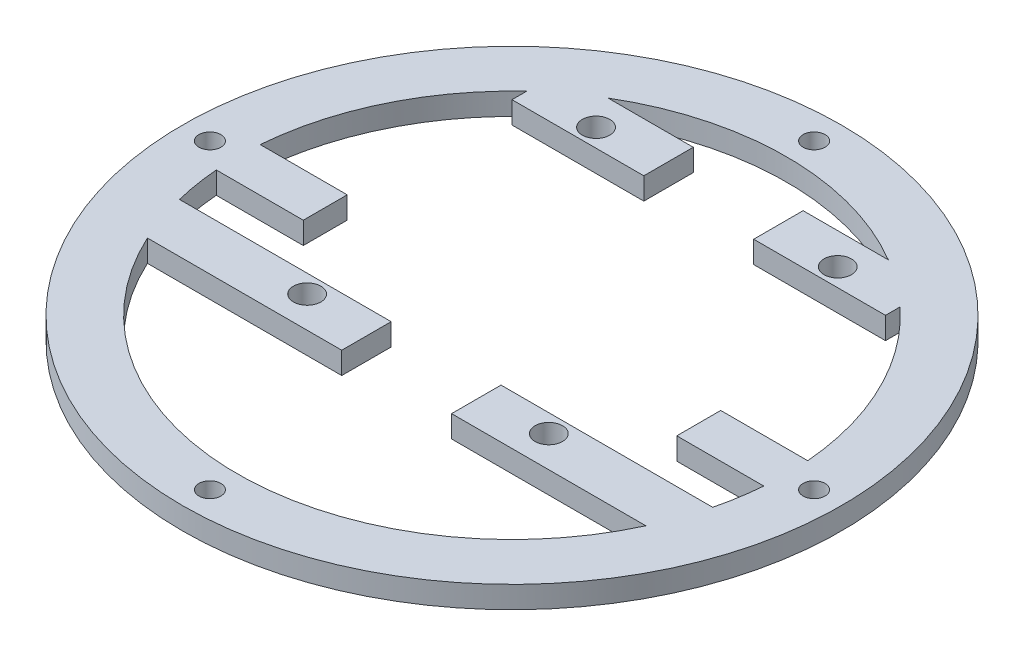
ISO-10303-21;
HEADER;
FILE_DESCRIPTION(('STEP AP214'),'2;1');
FILE_NAME('part.step','',(''),(''),'','','');
FILE_SCHEMA(('AUTOMOTIVE_DESIGN { 1 0 10303 214 1 1 1 1 }'));
ENDSEC;
DATA;
#1=APPLICATION_CONTEXT('core data for automotive mechanical design processes');
#2=APPLICATION_PROTOCOL_DEFINITION('international standard','automotive_design',2000,#1);
#3=PRODUCT_CONTEXT('',#1,'mechanical');
#4=PRODUCT('Part','Part','',(#3));
#5=PRODUCT_RELATED_PRODUCT_CATEGORY('part','',(#4));
#6=PRODUCT_DEFINITION_FORMATION('','',#4);
#7=PRODUCT_DEFINITION_CONTEXT('part definition',#1,'design');
#8=PRODUCT_DEFINITION('design','',#6,#7);
#9=PRODUCT_DEFINITION_SHAPE('','',#8);
#10=(LENGTH_UNIT() NAMED_UNIT(*) SI_UNIT(.MILLI.,.METRE.));
#11=(NAMED_UNIT(*) PLANE_ANGLE_UNIT() SI_UNIT($,.RADIAN.));
#12=(NAMED_UNIT(*) SI_UNIT($,.STERADIAN.) SOLID_ANGLE_UNIT());
#13=UNCERTAINTY_MEASURE_WITH_UNIT(LENGTH_MEASURE(1.E-05),#10,'distance_accuracy_value','');
#14=(GEOMETRIC_REPRESENTATION_CONTEXT(3) GLOBAL_UNCERTAINTY_ASSIGNED_CONTEXT((#13)) GLOBAL_UNIT_ASSIGNED_CONTEXT((#10,
#11,#12)) REPRESENTATION_CONTEXT('',''));
#15=CARTESIAN_POINT('',(0.,0.,0.));
#16=DIRECTION('',(0.,0.,1.));
#17=DIRECTION('',(1.,0.,0.));
#18=AXIS2_PLACEMENT_3D('',#15,#16,#17);
#19=CARTESIAN_POINT('',(0.,2.,0.));
#20=DIRECTION('',(0.,-1.,0.));
#21=DIRECTION('',(0.,0.,-1.));
#22=AXIS2_PLACEMENT_3D('',#19,#20,#21);
#23=CYLINDRICAL_SURFACE('',#22,25.);
#24=CARTESIAN_POINT('',(0.,2.,0.));
#25=DIRECTION('',(0.,1.,0.));
#26=DIRECTION('',(0.,0.,1.));
#27=AXIS2_PLACEMENT_3D('',#24,#25,#26);
#28=CIRCLE('',#27,25.);
#29=CARTESIAN_POINT('',(-24.9198715887542,2.,2.));
#30=VERTEX_POINT('',#29);
#31=CARTESIAN_POINT('',(-24.2693221990232,2.,6.));
#32=VERTEX_POINT('',#31);
#33=EDGE_CURVE('E321',#30,#32,#28,.T.);
#34=ORIENTED_EDGE('',*,*,#33,.T.);
#35=DIRECTION('',(0.,-1.,0.));
#36=VECTOR('',#35,1.);
#37=CARTESIAN_POINT('',(-24.2693221990232,2.,6.));
#38=LINE('',#37,#36);
#39=CARTESIAN_POINT('',(-24.2693221990232,0.,6.));
#40=VERTEX_POINT('',#39);
#41=EDGE_CURVE('E221',#32,#40,#38,.T.);
#42=ORIENTED_EDGE('',*,*,#41,.T.);
#43=CARTESIAN_POINT('',(0.,0.,0.));
#44=DIRECTION('',(0.,1.,0.));
#45=DIRECTION('',(0.,0.,1.));
#46=AXIS2_PLACEMENT_3D('',#43,#44,#45);
#47=CIRCLE('',#46,25.);
#48=CARTESIAN_POINT('',(-24.9198715887542,0.,2.));
#49=VERTEX_POINT('',#48);
#50=EDGE_CURVE('E314',#49,#40,#47,.T.);
#51=ORIENTED_EDGE('',*,*,#50,.F.);
#52=DIRECTION('',(0.,-1.,0.));
#53=VECTOR('',#52,1.);
#54=CARTESIAN_POINT('',(-24.9198715887542,2.,2.));
#55=LINE('',#54,#53);
#56=EDGE_CURVE('E375',#30,#49,#55,.T.);
#57=ORIENTED_EDGE('',*,*,#56,.F.);
#58=EDGE_LOOP('',(#34,#42,#51,#57));
#59=FACE_BOUND('',#58,.T.);
#60=ADVANCED_FACE('F41',(#59),#23,.F.);
#61=CARTESIAN_POINT('',(-22.6881026090769,0.,10.5));
#62=VERTEX_POINT('',#61);
#63=CARTESIAN_POINT('',(22.6881026090769,0.,10.5));
#64=VERTEX_POINT('',#63);
#65=EDGE_CURVE('E319',#62,#64,#47,.T.);
#66=ORIENTED_EDGE('',*,*,#65,.F.);
#67=DIRECTION('',(0.,-1.,0.));
#68=VECTOR('',#67,1.);
#69=CARTESIAN_POINT('',(-22.6881026090769,2.,10.5));
#70=LINE('',#69,#68);
#71=CARTESIAN_POINT('',(-22.6881026090769,2.,10.5));
#72=VERTEX_POINT('',#71);
#73=EDGE_CURVE('E252',#72,#62,#70,.T.);
#74=ORIENTED_EDGE('',*,*,#73,.F.);
#75=CARTESIAN_POINT('',(22.6881026090769,2.,10.5));
#76=VERTEX_POINT('',#75);
#77=EDGE_CURVE('E325',#72,#76,#28,.T.);
#78=ORIENTED_EDGE('',*,*,#77,.T.);
#79=DIRECTION('',(0.,-1.,0.));
#80=VECTOR('',#79,1.);
#81=CARTESIAN_POINT('',(22.6881026090769,2.,10.5));
#82=LINE('',#81,#80);
#83=EDGE_CURVE('E292',#76,#64,#82,.T.);
#84=ORIENTED_EDGE('',*,*,#83,.T.);
#85=EDGE_LOOP('',(#66,#74,#78,#84));
#86=FACE_BOUND('',#85,.T.);
#87=ADVANCED_FACE('F537',(#86),#23,.F.);
#88=CARTESIAN_POINT('',(24.2693221990232,0.,6.));
#89=VERTEX_POINT('',#88);
#90=CARTESIAN_POINT('',(24.9198715887542,0.,2.));
#91=VERTEX_POINT('',#90);
#92=EDGE_CURVE('E469',#89,#91,#47,.T.);
#93=ORIENTED_EDGE('',*,*,#92,.F.);
#94=DIRECTION('',(0.,-1.,0.));
#95=VECTOR('',#94,1.);
#96=CARTESIAN_POINT('',(24.2693221990232,2.,6.));
#97=LINE('',#96,#95);
#98=CARTESIAN_POINT('',(24.2693221990232,2.,6.));
#99=VERTEX_POINT('',#98);
#100=EDGE_CURVE('E284',#99,#89,#97,.T.);
#101=ORIENTED_EDGE('',*,*,#100,.F.);
#102=CARTESIAN_POINT('',(24.9198715887542,2.,2.));
#103=VERTEX_POINT('',#102);
#104=EDGE_CURVE('E384',#99,#103,#28,.T.);
#105=ORIENTED_EDGE('',*,*,#104,.T.);
#106=DIRECTION('',(0.,-1.,0.));
#107=VECTOR('',#106,1.);
#108=CARTESIAN_POINT('',(24.9198715887542,2.,2.));
#109=LINE('',#108,#107);
#110=EDGE_CURVE('E324',#103,#91,#109,.T.);
#111=ORIENTED_EDGE('',*,*,#110,.T.);
#112=EDGE_LOOP('',(#93,#101,#105,#111));
#113=FACE_BOUND('',#112,.T.);
#114=ADVANCED_FACE('F548',(#113),#23,.F.);
#115=CARTESIAN_POINT('',(17.,2.,0.));
#116=DIRECTION('',(-1.,0.,0.));
#117=DIRECTION('',(0.,0.,1.));
#118=AXIS2_PLACEMENT_3D('',#115,#116,#117);
#119=PLANE('',#118);
#120=DIRECTION('',(0.,1.,0.));
#121=VECTOR('',#120,1.);
#122=CARTESIAN_POINT('',(17.,0.,-17.));
#123=LINE('',#122,#121);
#124=CARTESIAN_POINT('',(17.,0.,-17.));
#125=VERTEX_POINT('',#124);
#126=CARTESIAN_POINT('',(17.,2.,-17.));
#127=VERTEX_POINT('',#126);
#128=EDGE_CURVE('E442',#125,#127,#123,.T.);
#129=ORIENTED_EDGE('',*,*,#128,.F.);
#130=DIRECTION('',(0.,0.,-1.));
#131=VECTOR('',#130,1.);
#132=CARTESIAN_POINT('',(17.,0.,0.));
#133=LINE('',#132,#131);
#134=CARTESIAN_POINT('',(17.,0.,-18.3303027798234));
#135=VERTEX_POINT('',#134);
#136=EDGE_CURVE('E296',#125,#135,#133,.T.);
#137=ORIENTED_EDGE('',*,*,#136,.T.);
#138=DIRECTION('',(0.,-1.,0.));
#139=VECTOR('',#138,1.);
#140=CARTESIAN_POINT('',(17.,2.,-18.3303027798234));
#141=LINE('',#140,#139);
#142=CARTESIAN_POINT('',(17.,2.,-18.3303027798234));
#143=VERTEX_POINT('',#142);
#144=EDGE_CURVE('E401',#143,#135,#141,.T.);
#145=ORIENTED_EDGE('',*,*,#144,.F.);
#146=DIRECTION('',(0.,0.,-1.));
#147=VECTOR('',#146,1.);
#148=CARTESIAN_POINT('',(17.,2.,10.5));
#149=LINE('',#148,#147);
#150=EDGE_CURVE('E394',#127,#143,#149,.T.);
#151=ORIENTED_EDGE('',*,*,#150,.F.);
#152=EDGE_LOOP('',(#129,#137,#145,#151));
#153=FACE_BOUND('',#152,.T.);
#154=ADVANCED_FACE('F586',(#153),#119,.F.);
#155=CARTESIAN_POINT('',(5.,2.,-21.5));
#156=DIRECTION('',(1.,0.,0.));
#157=DIRECTION('',(0.,0.,-1.));
#158=AXIS2_PLACEMENT_3D('',#155,#156,#157);
#159=PLANE('',#158);
#160=DIRECTION('',(0.,1.,0.));
#161=VECTOR('',#160,1.);
#162=CARTESIAN_POINT('',(5.,0.,-17.));
#163=LINE('',#162,#161);
#164=CARTESIAN_POINT('',(5.,0.,-17.));
#165=VERTEX_POINT('',#164);
#166=CARTESIAN_POINT('',(5.,2.,-17.));
#167=VERTEX_POINT('',#166);
#168=EDGE_CURVE('E414',#165,#167,#163,.T.);
#169=ORIENTED_EDGE('',*,*,#168,.T.);
#170=DIRECTION('',(0.,0.,1.));
#171=VECTOR('',#170,1.);
#172=CARTESIAN_POINT('',(5.,2.,-21.5));
#173=LINE('',#172,#171);
#174=CARTESIAN_POINT('',(5.,2.,-21.5));
#175=VERTEX_POINT('',#174);
#176=EDGE_CURVE('E419',#175,#167,#173,.T.);
#177=ORIENTED_EDGE('',*,*,#176,.F.);
#178=DIRECTION('',(0.,-1.,0.));
#179=VECTOR('',#178,1.);
#180=CARTESIAN_POINT('',(5.,2.,-21.5));
#181=LINE('',#180,#179);
#182=CARTESIAN_POINT('',(5.,0.,-21.5));
#183=VERTEX_POINT('',#182);
#184=EDGE_CURVE('E409',#175,#183,#181,.T.);
#185=ORIENTED_EDGE('',*,*,#184,.T.);
#186=DIRECTION('',(0.,0.,1.));
#187=VECTOR('',#186,1.);
#188=CARTESIAN_POINT('',(5.,0.,-21.5));
#189=LINE('',#188,#187);
#190=EDGE_CURVE('E413',#183,#165,#189,.T.);
#191=ORIENTED_EDGE('',*,*,#190,.T.);
#192=EDGE_LOOP('',(#169,#177,#185,#191));
#193=FACE_BOUND('',#192,.T.);
#194=ADVANCED_FACE('F593',(#193),#159,.F.);
#195=CARTESIAN_POINT('',(-17.,0.,-18.3303027798234));
#196=VERTEX_POINT('',#195);
#197=CARTESIAN_POINT('',(-24.9198715887542,0.,-2.));
#198=VERTEX_POINT('',#197);
#199=EDGE_CURVE('E358',#196,#198,#47,.T.);
#200=ORIENTED_EDGE('',*,*,#199,.F.);
#201=DIRECTION('',(0.,-1.,0.));
#202=VECTOR('',#201,1.);
#203=CARTESIAN_POINT('',(-17.,2.,-18.3303027798234));
#204=LINE('',#203,#202);
#205=CARTESIAN_POINT('',(-17.,2.,-18.3303027798234));
#206=VERTEX_POINT('',#205);
#207=EDGE_CURVE('E424',#206,#196,#204,.T.);
#208=ORIENTED_EDGE('',*,*,#207,.F.);
#209=CARTESIAN_POINT('',(-24.9198715887542,2.,-2.));
#210=VERTEX_POINT('',#209);
#211=EDGE_CURVE('E374',#206,#210,#28,.T.);
#212=ORIENTED_EDGE('',*,*,#211,.T.);
#213=DIRECTION('',(0.,-1.,0.));
#214=VECTOR('',#213,1.);
#215=CARTESIAN_POINT('',(-24.9198715887542,2.,-2.));
#216=LINE('',#215,#214);
#217=EDGE_CURVE('E369',#210,#198,#216,.T.);
#218=ORIENTED_EDGE('',*,*,#217,.T.);
#219=EDGE_LOOP('',(#200,#208,#212,#218));
#220=FACE_BOUND('',#219,.T.);
#221=ADVANCED_FACE('F601',(#220),#23,.F.);
#222=CARTESIAN_POINT('',(12.7573508221731,2.,-21.5));
#223=VERTEX_POINT('',#222);
#224=CARTESIAN_POINT('',(-12.7573508221731,2.,-21.5));
#225=VERTEX_POINT('',#224);
#226=EDGE_CURVE('E373',#223,#225,#28,.T.);
#227=ORIENTED_EDGE('',*,*,#226,.T.);
#228=DIRECTION('',(0.,-1.,0.));
#229=VECTOR('',#228,1.);
#230=CARTESIAN_POINT('',(-12.7573508221731,2.,-21.5));
#231=LINE('',#230,#229);
#232=CARTESIAN_POINT('',(-12.7573508221731,0.,-21.5));
#233=VERTEX_POINT('',#232);
#234=EDGE_CURVE('E380',#225,#233,#231,.T.);
#235=ORIENTED_EDGE('',*,*,#234,.T.);
#236=CARTESIAN_POINT('',(12.7573508221731,0.,-21.5));
#237=VERTEX_POINT('',#236);
#238=EDGE_CURVE('E474',#237,#233,#47,.T.);
#239=ORIENTED_EDGE('',*,*,#238,.F.);
#240=DIRECTION('',(0.,-1.,0.));
#241=VECTOR('',#240,1.);
#242=CARTESIAN_POINT('',(12.7573508221731,2.,-21.5));
#243=LINE('',#242,#241);
#244=EDGE_CURVE('E405',#223,#237,#243,.T.);
#245=ORIENTED_EDGE('',*,*,#244,.F.);
#246=EDGE_LOOP('',(#227,#235,#239,#245));
#247=FACE_BOUND('',#246,.T.);
#248=ADVANCED_FACE('F596',(#247),#23,.F.);
#249=CARTESIAN_POINT('',(0.,2.,2.));
#250=DIRECTION('',(0.,0.,-1.));
#251=DIRECTION('',(-1.,0.,0.));
#252=AXIS2_PLACEMENT_3D('',#249,#250,#251);
#253=PLANE('',#252);
#254=DIRECTION('',(0.,-1.,0.));
#255=VECTOR('',#254,1.);
#256=CARTESIAN_POINT('',(-17.,2.,2.));
#257=LINE('',#256,#255);
#258=CARTESIAN_POINT('',(-17.,2.,2.));
#259=VERTEX_POINT('',#258);
#260=CARTESIAN_POINT('',(-17.,0.,2.));
#261=VERTEX_POINT('',#260);
#262=EDGE_CURVE('E11',#259,#261,#257,.T.);
#263=ORIENTED_EDGE('',*,*,#262,.F.);
#264=DIRECTION('',(1.,0.,0.));
#265=VECTOR('',#264,1.);
#266=CARTESIAN_POINT('',(0.,2.,2.));
#267=LINE('',#266,#265);
#268=EDGE_CURVE('E313',#30,#259,#267,.T.);
#269=ORIENTED_EDGE('',*,*,#268,.F.);
#270=ORIENTED_EDGE('',*,*,#56,.T.);
#271=DIRECTION('',(1.,0.,0.));
#272=VECTOR('',#271,1.);
#273=CARTESIAN_POINT('',(0.,0.,2.));
#274=LINE('',#273,#272);
#275=EDGE_CURVE('E379',#49,#261,#274,.T.);
#276=ORIENTED_EDGE('',*,*,#275,.T.);
#277=EDGE_LOOP('',(#263,#269,#270,#276));
#278=FACE_BOUND('',#277,.T.);
#279=ADVANCED_FACE('F610',(#278),#253,.F.);
#280=CARTESIAN_POINT('',(0.,2.,-2.));
#281=DIRECTION('',(0.,0.,1.));
#282=DIRECTION('',(1.,0.,0.));
#283=AXIS2_PLACEMENT_3D('',#280,#281,#282);
#284=PLANE('',#283);
#285=DIRECTION('',(0.,1.,0.));
#286=VECTOR('',#285,1.);
#287=CARTESIAN_POINT('',(-17.,2.,-2.));
#288=LINE('',#287,#286);
#289=CARTESIAN_POINT('',(-17.,0.,-2.));
#290=VERTEX_POINT('',#289);
#291=CARTESIAN_POINT('',(-17.,2.,-2.));
#292=VERTEX_POINT('',#291);
#293=EDGE_CURVE('E400',#290,#292,#288,.T.);
#294=ORIENTED_EDGE('',*,*,#293,.F.);
#295=DIRECTION('',(-1.,0.,0.));
#296=VECTOR('',#295,1.);
#297=CARTESIAN_POINT('',(0.,0.,-2.));
#298=LINE('',#297,#296);
#299=EDGE_CURVE('E385',#290,#198,#298,.T.);
#300=ORIENTED_EDGE('',*,*,#299,.T.);
#301=ORIENTED_EDGE('',*,*,#217,.F.);
#302=DIRECTION('',(-1.,0.,0.));
#303=VECTOR('',#302,1.);
#304=CARTESIAN_POINT('',(0.,2.,-2.));
#305=LINE('',#304,#303);
#306=EDGE_CURVE('E362',#292,#210,#305,.T.);
#307=ORIENTED_EDGE('',*,*,#306,.F.);
#308=EDGE_LOOP('',(#294,#300,#301,#307));
#309=FACE_BOUND('',#308,.T.);
#310=ADVANCED_FACE('F606',(#309),#284,.F.);
#311=CARTESIAN_POINT('',(24.9198715887542,2.,-2.));
#312=VERTEX_POINT('',#311);
#313=EDGE_CURVE('E326',#312,#143,#28,.T.);
#314=ORIENTED_EDGE('',*,*,#313,.T.);
#315=ORIENTED_EDGE('',*,*,#144,.T.);
#316=CARTESIAN_POINT('',(24.9198715887542,0.,-2.));
#317=VERTEX_POINT('',#316);
#318=EDGE_CURVE('E320',#317,#135,#47,.T.);
#319=ORIENTED_EDGE('',*,*,#318,.F.);
#320=DIRECTION('',(0.,-1.,0.));
#321=VECTOR('',#320,1.);
#322=CARTESIAN_POINT('',(24.9198715887542,2.,-2.));
#323=LINE('',#322,#321);
#324=EDGE_CURVE('E363',#312,#317,#323,.T.);
#325=ORIENTED_EDGE('',*,*,#324,.F.);
#326=EDGE_LOOP('',(#314,#315,#319,#325));
#327=FACE_BOUND('',#326,.T.);
#328=ADVANCED_FACE('F581',(#327),#23,.F.);
#329=DIRECTION('',(0.,1.,0.));
#330=VECTOR('',#329,1.);
#331=CARTESIAN_POINT('',(17.,2.,2.));
#332=LINE('',#331,#330);
#333=CARTESIAN_POINT('',(17.,0.,2.));
#334=VERTEX_POINT('',#333);
#335=CARTESIAN_POINT('',(17.,2.,2.));
#336=VERTEX_POINT('',#335);
#337=EDGE_CURVE('E300',#334,#336,#332,.T.);
#338=ORIENTED_EDGE('',*,*,#337,.F.);
#339=EDGE_CURVE('E368',#334,#91,#274,.T.);
#340=ORIENTED_EDGE('',*,*,#339,.T.);
#341=ORIENTED_EDGE('',*,*,#110,.F.);
#342=EDGE_CURVE('E393',#336,#103,#267,.T.);
#343=ORIENTED_EDGE('',*,*,#342,.F.);
#344=EDGE_LOOP('',(#338,#340,#341,#343));
#345=FACE_BOUND('',#344,.T.);
#346=ADVANCED_FACE('F554',(#345),#253,.F.);
#347=DIRECTION('',(0.,-1.,0.));
#348=VECTOR('',#347,1.);
#349=CARTESIAN_POINT('',(17.,2.,-2.));
#350=LINE('',#349,#348);
#351=CARTESIAN_POINT('',(17.,2.,-2.));
#352=VERTEX_POINT('',#351);
#353=CARTESIAN_POINT('',(17.,0.,-2.));
#354=VERTEX_POINT('',#353);
#355=EDGE_CURVE('E297',#352,#354,#350,.T.);
#356=ORIENTED_EDGE('',*,*,#355,.F.);
#357=EDGE_CURVE('E389',#312,#352,#305,.T.);
#358=ORIENTED_EDGE('',*,*,#357,.F.);
#359=ORIENTED_EDGE('',*,*,#324,.T.);
#360=EDGE_CURVE('E367',#317,#354,#298,.T.);
#361=ORIENTED_EDGE('',*,*,#360,.T.);
#362=EDGE_LOOP('',(#356,#358,#359,#361));
#363=FACE_BOUND('',#362,.T.);
#364=ADVANCED_FACE('F575',(#363),#284,.F.);
#365=CARTESIAN_POINT('',(0.,2.,0.));
#366=DIRECTION('',(0.,1.,0.));
#367=DIRECTION('',(0.,0.,1.));
#368=AXIS2_PLACEMENT_3D('',#365,#366,#367);
#369=PLANE('',#368);
#370=CARTESIAN_POINT('',(-11.,2.,-18.65));
#371=DIRECTION('',(0.,1.,0.));
#372=DIRECTION('',(0.,0.,1.));
#373=AXIS2_PLACEMENT_3D('',#370,#371,#372);
#374=CIRCLE('',#373,1.25);
#375=CARTESIAN_POINT('',(-11.,2.,-17.4));
#376=VERTEX_POINT('',#375);
#377=EDGE_CURVE('E704',#376,#376,#374,.T.);
#378=ORIENTED_EDGE('',*,*,#377,.F.);
#379=EDGE_LOOP('',(#378));
#380=FACE_BOUND('',#379,.T.);
#381=CARTESIAN_POINT('',(-11.,2.,7.65));
#382=DIRECTION('',(0.,1.,0.));
#383=DIRECTION('',(0.,0.,1.));
#384=AXIS2_PLACEMENT_3D('',#381,#382,#383);
#385=CIRCLE('',#384,1.25);
#386=CARTESIAN_POINT('',(-11.,2.,8.9));
#387=VERTEX_POINT('',#386);
#388=EDGE_CURVE('E710',#387,#387,#385,.T.);
#389=ORIENTED_EDGE('',*,*,#388,.F.);
#390=EDGE_LOOP('',(#389));
#391=FACE_BOUND('',#390,.T.);
#392=CARTESIAN_POINT('',(11.,2.,7.65));
#393=DIRECTION('',(0.,1.,0.));
#394=DIRECTION('',(0.,0.,1.));
#395=AXIS2_PLACEMENT_3D('',#392,#393,#394);
#396=CIRCLE('',#395,1.25);
#397=CARTESIAN_POINT('',(11.,2.,8.9));
#398=VERTEX_POINT('',#397);
#399=EDGE_CURVE('E699',#398,#398,#396,.T.);
#400=ORIENTED_EDGE('',*,*,#399,.F.);
#401=EDGE_LOOP('',(#400));
#402=FACE_BOUND('',#401,.T.);
#403=CARTESIAN_POINT('',(11.,2.,-18.65));
#404=DIRECTION('',(0.,1.,0.));
#405=DIRECTION('',(0.,0.,1.));
#406=AXIS2_PLACEMENT_3D('',#403,#404,#405);
#407=CIRCLE('',#406,1.25);
#408=CARTESIAN_POINT('',(11.,2.,-17.4));
#409=VERTEX_POINT('',#408);
#410=EDGE_CURVE('E695',#409,#409,#407,.T.);
#411=ORIENTED_EDGE('',*,*,#410,.F.);
#412=EDGE_LOOP('',(#411));
#413=FACE_BOUND('',#412,.T.);
#414=DIRECTION('',(0.,0.,1.));
#415=VECTOR('',#414,1.);
#416=CARTESIAN_POINT('',(-17.,2.,0.));
#417=LINE('',#416,#415);
#418=EDGE_CURVE('E51',#292,#259,#417,.T.);
#419=ORIENTED_EDGE('',*,*,#418,.F.);
#420=ORIENTED_EDGE('',*,*,#306,.T.);
#421=ORIENTED_EDGE('',*,*,#211,.F.);
#422=DIRECTION('',(0.,0.,1.));
#423=VECTOR('',#422,1.);
#424=CARTESIAN_POINT('',(-17.,2.,-18.3303027798234));
#425=LINE('',#424,#423);
#426=CARTESIAN_POINT('',(-17.,2.,-17.));
#427=VERTEX_POINT('',#426);
#428=EDGE_CURVE('E492',#206,#427,#425,.T.);
#429=ORIENTED_EDGE('',*,*,#428,.T.);
#430=DIRECTION('',(-1.,0.,0.));
#431=VECTOR('',#430,1.);
#432=CARTESIAN_POINT('',(0.,2.,-17.));
#433=LINE('',#432,#431);
#434=CARTESIAN_POINT('',(-5.,2.,-17.));
#435=VERTEX_POINT('',#434);
#436=EDGE_CURVE('E433',#435,#427,#433,.T.);
#437=ORIENTED_EDGE('',*,*,#436,.F.);
#438=DIRECTION('',(0.,0.,-1.));
#439=VECTOR('',#438,1.);
#440=CARTESIAN_POINT('',(-5.,2.,10.5));
#441=LINE('',#440,#439);
#442=CARTESIAN_POINT('',(-5.,2.,-21.5));
#443=VERTEX_POINT('',#442);
#444=EDGE_CURVE('E441',#435,#443,#441,.T.);
#445=ORIENTED_EDGE('',*,*,#444,.T.);
#446=DIRECTION('',(-1.,0.,0.));
#447=VECTOR('',#446,1.);
#448=CARTESIAN_POINT('',(-5.,2.,-21.5));
#449=LINE('',#448,#447);
#450=EDGE_CURVE('E420',#443,#225,#449,.T.);
#451=ORIENTED_EDGE('',*,*,#450,.T.);
#452=ORIENTED_EDGE('',*,*,#226,.F.);
#453=DIRECTION('',(-1.,0.,0.));
#454=VECTOR('',#453,1.);
#455=CARTESIAN_POINT('',(12.7573508221731,2.,-21.5));
#456=LINE('',#455,#454);
#457=EDGE_CURVE('E417',#223,#175,#456,.T.);
#458=ORIENTED_EDGE('',*,*,#457,.T.);
#459=ORIENTED_EDGE('',*,*,#176,.T.);
#460=DIRECTION('',(1.,0.,0.));
#461=VECTOR('',#460,1.);
#462=CARTESIAN_POINT('',(0.,2.,-17.));
#463=LINE('',#462,#461);
#464=EDGE_CURVE('E460',#167,#127,#463,.T.);
#465=ORIENTED_EDGE('',*,*,#464,.T.);
#466=ORIENTED_EDGE('',*,*,#150,.T.);
#467=ORIENTED_EDGE('',*,*,#313,.F.);
#468=ORIENTED_EDGE('',*,*,#357,.T.);
#469=DIRECTION('',(0.,0.,-1.));
#470=VECTOR('',#469,1.);
#471=CARTESIAN_POINT('',(17.,2.,0.));
#472=LINE('',#471,#470);
#473=EDGE_CURVE('E301',#336,#352,#472,.T.);
#474=ORIENTED_EDGE('',*,*,#473,.F.);
#475=ORIENTED_EDGE('',*,*,#342,.T.);
#476=ORIENTED_EDGE('',*,*,#104,.F.);
#477=DIRECTION('',(-1.,0.,0.));
#478=VECTOR('',#477,1.);
#479=CARTESIAN_POINT('',(17.,2.,6.));
#480=LINE('',#479,#478);
#481=CARTESIAN_POINT('',(5.,2.,6.));
#482=VERTEX_POINT('',#481);
#483=EDGE_CURVE('E281',#99,#482,#480,.T.);
#484=ORIENTED_EDGE('',*,*,#483,.T.);
#485=DIRECTION('',(0.,0.,1.));
#486=VECTOR('',#485,1.);
#487=CARTESIAN_POINT('',(5.,2.,-21.5));
#488=LINE('',#487,#486);
#489=CARTESIAN_POINT('',(5.,2.,10.5));
#490=VERTEX_POINT('',#489);
#491=EDGE_CURVE('E265',#482,#490,#488,.T.);
#492=ORIENTED_EDGE('',*,*,#491,.T.);
#493=DIRECTION('',(1.,0.,0.));
#494=VECTOR('',#493,1.);
#495=CARTESIAN_POINT('',(17.,2.,10.5));
#496=LINE('',#495,#494);
#497=EDGE_CURVE('E277',#490,#76,#496,.T.);
#498=ORIENTED_EDGE('',*,*,#497,.T.);
#499=ORIENTED_EDGE('',*,*,#77,.F.);
#500=DIRECTION('',(1.,0.,0.));
#501=VECTOR('',#500,1.);
#502=CARTESIAN_POINT('',(-17.,2.,10.5));
#503=LINE('',#502,#501);
#504=CARTESIAN_POINT('',(-5.,2.,10.5));
#505=VERTEX_POINT('',#504);
#506=EDGE_CURVE('E227',#72,#505,#503,.T.);
#507=ORIENTED_EDGE('',*,*,#506,.T.);
#508=DIRECTION('',(0.,0.,-1.));
#509=VECTOR('',#508,1.);
#510=CARTESIAN_POINT('',(-5.,2.,10.5));
#511=LINE('',#510,#509);
#512=CARTESIAN_POINT('',(-5.,2.,6.));
#513=VERTEX_POINT('',#512);
#514=EDGE_CURVE('E233',#505,#513,#511,.T.);
#515=ORIENTED_EDGE('',*,*,#514,.T.);
#516=DIRECTION('',(-1.,0.,0.));
#517=VECTOR('',#516,1.);
#518=CARTESIAN_POINT('',(-17.,2.,6.));
#519=LINE('',#518,#517);
#520=EDGE_CURVE('E215',#513,#32,#519,.T.);
#521=ORIENTED_EDGE('',*,*,#520,.T.);
#522=ORIENTED_EDGE('',*,*,#33,.F.);
#523=ORIENTED_EDGE('',*,*,#268,.T.);
#524=EDGE_LOOP('',(#419,#420,#421,#429,#437,#445,#451,#452,#458,#459,#465,#466,#467,#468,#474,
#475,#476,#484,#492,#498,#499,#507,#515,#521,#522,#523));
#525=FACE_BOUND('',#524,.T.);
#526=CARTESIAN_POINT('',(-27.5,2.,0.));
#527=DIRECTION('',(0.,1.,0.));
#528=DIRECTION('',(0.,0.,1.));
#529=AXIS2_PLACEMENT_3D('',#526,#527,#528);
#530=CIRCLE('',#529,1.);
#531=CARTESIAN_POINT('',(-27.5,2.,1.));
#532=VERTEX_POINT('',#531);
#533=EDGE_CURVE('E350',#532,#532,#530,.T.);
#534=ORIENTED_EDGE('',*,*,#533,.F.);
#535=EDGE_LOOP('',(#534));
#536=FACE_BOUND('',#535,.T.);
#537=CARTESIAN_POINT('',(0.,2.,27.5));
#538=DIRECTION('',(0.,1.,0.));
#539=DIRECTION('',(0.,0.,1.));
#540=AXIS2_PLACEMENT_3D('',#537,#538,#539);
#541=CIRCLE('',#540,0.999999999999999);
#542=CARTESIAN_POINT('',(0.,2.,28.5));
#543=VERTEX_POINT('',#542);
#544=EDGE_CURVE('E342',#543,#543,#541,.T.);
#545=ORIENTED_EDGE('',*,*,#544,.F.);
#546=EDGE_LOOP('',(#545));
#547=FACE_BOUND('',#546,.T.);
#548=CARTESIAN_POINT('',(27.5,2.,0.));
#549=DIRECTION('',(0.,1.,0.));
#550=DIRECTION('',(0.,0.,1.));
#551=AXIS2_PLACEMENT_3D('',#548,#549,#550);
#552=CIRCLE('',#551,1.);
#553=CARTESIAN_POINT('',(27.5,2.,1.));
#554=VERTEX_POINT('',#553);
#555=EDGE_CURVE('E334',#554,#554,#552,.T.);
#556=ORIENTED_EDGE('',*,*,#555,.F.);
#557=EDGE_LOOP('',(#556));
#558=FACE_BOUND('',#557,.T.);
#559=CARTESIAN_POINT('',(0.,2.,-27.5));
#560=DIRECTION('',(0.,1.,0.));
#561=DIRECTION('',(0.,0.,1.));
#562=AXIS2_PLACEMENT_3D('',#559,#560,#561);
#563=CIRCLE('',#562,1.);
#564=CARTESIAN_POINT('',(0.,2.,-26.5));
#565=VERTEX_POINT('',#564);
#566=EDGE_CURVE('E306',#565,#565,#563,.T.);
#567=ORIENTED_EDGE('',*,*,#566,.F.);
#568=EDGE_LOOP('',(#567));
#569=FACE_BOUND('',#568,.T.);
#570=CARTESIAN_POINT('',(0.,2.,0.));
#571=DIRECTION('',(0.,1.,0.));
#572=DIRECTION('',(0.,0.,1.));
#573=AXIS2_PLACEMENT_3D('',#570,#571,#572);
#574=CIRCLE('',#573,30.);
#575=CARTESIAN_POINT('',(0.,2.,30.));
#576=VERTEX_POINT('',#575);
#577=EDGE_CURVE('E308',#576,#576,#574,.T.);
#578=ORIENTED_EDGE('',*,*,#577,.T.);
#579=EDGE_LOOP('',(#578));
#580=FACE_BOUND('',#579,.T.);
#581=ADVANCED_FACE('F43',(#380,#391,#402,#413,#525,#536,#547,#558,#569,#580),#369,.T.);
#582=CARTESIAN_POINT('',(0.,0.,0.));
#583=DIRECTION('',(0.,1.,0.));
#584=DIRECTION('',(0.,0.,1.));
#585=AXIS2_PLACEMENT_3D('',#582,#583,#584);
#586=PLANE('',#585);
#587=CARTESIAN_POINT('',(-11.,0.,-18.65));
#588=DIRECTION('',(0.,1.,0.));
#589=DIRECTION('',(0.,0.,1.));
#590=AXIS2_PLACEMENT_3D('',#587,#588,#589);
#591=CIRCLE('',#590,1.25);
#592=CARTESIAN_POINT('',(-11.,0.,-17.4));
#593=VERTEX_POINT('',#592);
#594=EDGE_CURVE('E682',#593,#593,#591,.T.);
#595=ORIENTED_EDGE('',*,*,#594,.T.);
#596=EDGE_LOOP('',(#595));
#597=FACE_BOUND('',#596,.T.);
#598=CARTESIAN_POINT('',(-11.,0.,7.65));
#599=DIRECTION('',(0.,1.,0.));
#600=DIRECTION('',(0.,0.,1.));
#601=AXIS2_PLACEMENT_3D('',#598,#599,#600);
#602=CIRCLE('',#601,1.25);
#603=CARTESIAN_POINT('',(-11.,0.,8.9));
#604=VERTEX_POINT('',#603);
#605=EDGE_CURVE('E686',#604,#604,#602,.T.);
#606=ORIENTED_EDGE('',*,*,#605,.T.);
#607=EDGE_LOOP('',(#606));
#608=FACE_BOUND('',#607,.T.);
#609=CARTESIAN_POINT('',(11.,0.,7.65));
#610=DIRECTION('',(0.,1.,0.));
#611=DIRECTION('',(0.,0.,1.));
#612=AXIS2_PLACEMENT_3D('',#609,#610,#611);
#613=CIRCLE('',#612,1.25);
#614=CARTESIAN_POINT('',(11.,0.,8.9));
#615=VERTEX_POINT('',#614);
#616=EDGE_CURVE('E690',#615,#615,#613,.T.);
#617=ORIENTED_EDGE('',*,*,#616,.T.);
#618=EDGE_LOOP('',(#617));
#619=FACE_BOUND('',#618,.T.);
#620=CARTESIAN_POINT('',(11.,0.,-18.65));
#621=DIRECTION('',(0.,1.,0.));
#622=DIRECTION('',(0.,0.,1.));
#623=AXIS2_PLACEMENT_3D('',#620,#621,#622);
#624=CIRCLE('',#623,1.25);
#625=CARTESIAN_POINT('',(11.,0.,-17.4));
#626=VERTEX_POINT('',#625);
#627=EDGE_CURVE('E615',#626,#626,#624,.T.);
#628=ORIENTED_EDGE('',*,*,#627,.T.);
#629=EDGE_LOOP('',(#628));
#630=FACE_BOUND('',#629,.T.);
#631=ORIENTED_EDGE('',*,*,#299,.F.);
#632=DIRECTION('',(0.,0.,1.));
#633=VECTOR('',#632,1.);
#634=CARTESIAN_POINT('',(-17.,0.,0.));
#635=LINE('',#634,#633);
#636=EDGE_CURVE('E312',#290,#261,#635,.T.);
#637=ORIENTED_EDGE('',*,*,#636,.T.);
#638=ORIENTED_EDGE('',*,*,#275,.F.);
#639=ORIENTED_EDGE('',*,*,#50,.T.);
#640=DIRECTION('',(-1.,0.,0.));
#641=VECTOR('',#640,1.);
#642=CARTESIAN_POINT('',(-17.,0.,6.));
#643=LINE('',#642,#641);
#644=CARTESIAN_POINT('',(-5.,0.,6.));
#645=VERTEX_POINT('',#644);
#646=EDGE_CURVE('E243',#645,#40,#643,.T.);
#647=ORIENTED_EDGE('',*,*,#646,.F.);
#648=DIRECTION('',(0.,0.,-1.));
#649=VECTOR('',#648,1.);
#650=CARTESIAN_POINT('',(-5.,0.,0.));
#651=LINE('',#650,#649);
#652=CARTESIAN_POINT('',(-5.,0.,10.5));
#653=VERTEX_POINT('',#652);
#654=EDGE_CURVE('E234',#653,#645,#651,.T.);
#655=ORIENTED_EDGE('',*,*,#654,.F.);
#656=DIRECTION('',(1.,0.,0.));
#657=VECTOR('',#656,1.);
#658=CARTESIAN_POINT('',(-17.,0.,10.5));
#659=LINE('',#658,#657);
#660=EDGE_CURVE('E59',#62,#653,#659,.T.);
#661=ORIENTED_EDGE('',*,*,#660,.F.);
#662=ORIENTED_EDGE('',*,*,#65,.T.);
#663=DIRECTION('',(1.,0.,0.));
#664=VECTOR('',#663,1.);
#665=CARTESIAN_POINT('',(17.,0.,10.5));
#666=LINE('',#665,#664);
#667=CARTESIAN_POINT('',(5.,0.,10.5));
#668=VERTEX_POINT('',#667);
#669=EDGE_CURVE('E276',#668,#64,#666,.T.);
#670=ORIENTED_EDGE('',*,*,#669,.F.);
#671=DIRECTION('',(0.,0.,1.));
#672=VECTOR('',#671,1.);
#673=CARTESIAN_POINT('',(5.,0.,-21.5));
#674=LINE('',#673,#672);
#675=CARTESIAN_POINT('',(5.,0.,6.));
#676=VERTEX_POINT('',#675);
#677=EDGE_CURVE('E264',#676,#668,#674,.T.);
#678=ORIENTED_EDGE('',*,*,#677,.F.);
#679=DIRECTION('',(-1.,0.,0.));
#680=VECTOR('',#679,1.);
#681=CARTESIAN_POINT('',(17.,0.,6.));
#682=LINE('',#681,#680);
#683=EDGE_CURVE('E66',#89,#676,#682,.T.);
#684=ORIENTED_EDGE('',*,*,#683,.F.);
#685=ORIENTED_EDGE('',*,*,#92,.T.);
#686=ORIENTED_EDGE('',*,*,#339,.F.);
#687=DIRECTION('',(0.,0.,-1.));
#688=VECTOR('',#687,1.);
#689=CARTESIAN_POINT('',(17.,0.,0.));
#690=LINE('',#689,#688);
#691=EDGE_CURVE('E318',#334,#354,#690,.T.);
#692=ORIENTED_EDGE('',*,*,#691,.T.);
#693=ORIENTED_EDGE('',*,*,#360,.F.);
#694=ORIENTED_EDGE('',*,*,#318,.T.);
#695=ORIENTED_EDGE('',*,*,#136,.F.);
#696=DIRECTION('',(1.,0.,0.));
#697=VECTOR('',#696,1.);
#698=CARTESIAN_POINT('',(0.,0.,-17.));
#699=LINE('',#698,#697);
#700=EDGE_CURVE('E445',#165,#125,#699,.T.);
#701=ORIENTED_EDGE('',*,*,#700,.F.);
#702=ORIENTED_EDGE('',*,*,#190,.F.);
#703=DIRECTION('',(-1.,0.,0.));
#704=VECTOR('',#703,1.);
#705=CARTESIAN_POINT('',(12.7573508221731,0.,-21.5));
#706=LINE('',#705,#704);
#707=EDGE_CURVE('E354',#237,#183,#706,.T.);
#708=ORIENTED_EDGE('',*,*,#707,.F.);
#709=ORIENTED_EDGE('',*,*,#238,.T.);
#710=DIRECTION('',(-1.,0.,0.));
#711=VECTOR('',#710,1.);
#712=CARTESIAN_POINT('',(-5.,0.,-21.5));
#713=LINE('',#712,#711);
#714=CARTESIAN_POINT('',(-5.,0.,-21.5));
#715=VERTEX_POINT('',#714);
#716=EDGE_CURVE('E427',#715,#233,#713,.T.);
#717=ORIENTED_EDGE('',*,*,#716,.F.);
#718=DIRECTION('',(0.,0.,-1.));
#719=VECTOR('',#718,1.);
#720=CARTESIAN_POINT('',(-5.,0.,0.));
#721=LINE('',#720,#719);
#722=CARTESIAN_POINT('',(-5.,0.,-17.));
#723=VERTEX_POINT('',#722);
#724=EDGE_CURVE('E45',#723,#715,#721,.T.);
#725=ORIENTED_EDGE('',*,*,#724,.F.);
#726=DIRECTION('',(-1.,0.,0.));
#727=VECTOR('',#726,1.);
#728=CARTESIAN_POINT('',(0.,0.,-17.));
#729=LINE('',#728,#727);
#730=CARTESIAN_POINT('',(-17.,0.,-17.));
#731=VERTEX_POINT('',#730);
#732=EDGE_CURVE('E470',#723,#731,#729,.T.);
#733=ORIENTED_EDGE('',*,*,#732,.T.);
#734=DIRECTION('',(0.,0.,1.));
#735=VECTOR('',#734,1.);
#736=CARTESIAN_POINT('',(-17.,0.,-18.3303027798234));
#737=LINE('',#736,#735);
#738=EDGE_CURVE('E455',#196,#731,#737,.T.);
#739=ORIENTED_EDGE('',*,*,#738,.F.);
#740=ORIENTED_EDGE('',*,*,#199,.T.);
#741=EDGE_LOOP('',(#631,#637,#638,#639,#647,#655,#661,#662,#670,#678,#684,#685,#686,#692,#693,
#694,#695,#701,#702,#708,#709,#717,#725,#733,#739,#740));
#742=FACE_BOUND('',#741,.T.);
#743=CARTESIAN_POINT('',(-27.5,0.,0.));
#744=DIRECTION('',(0.,1.,0.));
#745=DIRECTION('',(0.,0.,1.));
#746=AXIS2_PLACEMENT_3D('',#743,#744,#745);
#747=CIRCLE('',#746,1.);
#748=CARTESIAN_POINT('',(-27.5,0.,1.));
#749=VERTEX_POINT('',#748);
#750=EDGE_CURVE('E346',#749,#749,#747,.T.);
#751=ORIENTED_EDGE('',*,*,#750,.T.);
#752=EDGE_LOOP('',(#751));
#753=FACE_BOUND('',#752,.T.);
#754=CARTESIAN_POINT('',(0.,0.,27.5));
#755=DIRECTION('',(0.,1.,0.));
#756=DIRECTION('',(0.,0.,1.));
#757=AXIS2_PLACEMENT_3D('',#754,#755,#756);
#758=CIRCLE('',#757,0.999999999999999);
#759=CARTESIAN_POINT('',(0.,0.,28.5));
#760=VERTEX_POINT('',#759);
#761=EDGE_CURVE('E338',#760,#760,#758,.T.);
#762=ORIENTED_EDGE('',*,*,#761,.T.);
#763=EDGE_LOOP('',(#762));
#764=FACE_BOUND('',#763,.T.);
#765=CARTESIAN_POINT('',(27.5,0.,0.));
#766=DIRECTION('',(0.,1.,0.));
#767=DIRECTION('',(0.,0.,1.));
#768=AXIS2_PLACEMENT_3D('',#765,#766,#767);
#769=CIRCLE('',#768,1.);
#770=CARTESIAN_POINT('',(27.5,0.,1.));
#771=VERTEX_POINT('',#770);
#772=EDGE_CURVE('E330',#771,#771,#769,.T.);
#773=ORIENTED_EDGE('',*,*,#772,.T.);
#774=EDGE_LOOP('',(#773));
#775=FACE_BOUND('',#774,.T.);
#776=CARTESIAN_POINT('',(0.,0.,-27.5));
#777=DIRECTION('',(0.,1.,0.));
#778=DIRECTION('',(0.,0.,1.));
#779=AXIS2_PLACEMENT_3D('',#776,#777,#778);
#780=CIRCLE('',#779,1.);
#781=CARTESIAN_POINT('',(0.,0.,-26.5));
#782=VERTEX_POINT('',#781);
#783=EDGE_CURVE('E307',#782,#782,#780,.T.);
#784=ORIENTED_EDGE('',*,*,#783,.T.);
#785=EDGE_LOOP('',(#784));
#786=FACE_BOUND('',#785,.T.);
#787=CARTESIAN_POINT('',(0.,0.,0.));
#788=DIRECTION('',(0.,1.,0.));
#789=DIRECTION('',(0.,0.,1.));
#790=AXIS2_PLACEMENT_3D('',#787,#788,#789);
#791=CIRCLE('',#790,30.);
#792=CARTESIAN_POINT('',(0.,0.,30.));
#793=VERTEX_POINT('',#792);
#794=EDGE_CURVE('E302',#793,#793,#791,.T.);
#795=ORIENTED_EDGE('',*,*,#794,.F.);
#796=EDGE_LOOP('',(#795));
#797=FACE_BOUND('',#796,.T.);
#798=ADVANCED_FACE('F513',(#597,#608,#619,#630,#742,#753,#764,#775,#786,#797),#586,.F.);
#799=CARTESIAN_POINT('',(0.,2.,0.));
#800=DIRECTION('',(0.,-1.,0.));
#801=DIRECTION('',(0.,0.,-1.));
#802=AXIS2_PLACEMENT_3D('',#799,#800,#801);
#803=CYLINDRICAL_SURFACE('',#802,30.);
#804=ORIENTED_EDGE('',*,*,#577,.F.);
#805=EDGE_LOOP('',(#804));
#806=FACE_BOUND('',#805,.T.);
#807=ORIENTED_EDGE('',*,*,#794,.T.);
#808=EDGE_LOOP('',(#807));
#809=FACE_BOUND('',#808,.T.);
#810=ADVANCED_FACE('F669',(#806,#809),#803,.T.);
#811=CARTESIAN_POINT('',(0.,0.,-27.5));
#812=DIRECTION('',(0.,1.,0.));
#813=DIRECTION('',(0.,0.,1.));
#814=AXIS2_PLACEMENT_3D('',#811,#812,#813);
#815=CYLINDRICAL_SURFACE('',#814,1.);
#816=ORIENTED_EDGE('',*,*,#783,.F.);
#817=EDGE_LOOP('',(#816));
#818=FACE_BOUND('',#817,.T.);
#819=ORIENTED_EDGE('',*,*,#566,.T.);
#820=EDGE_LOOP('',(#819));
#821=FACE_BOUND('',#820,.T.);
#822=ADVANCED_FACE('F676',(#818,#821),#815,.F.);
#823=CARTESIAN_POINT('',(27.5,0.,0.));
#824=DIRECTION('',(0.,1.,0.));
#825=DIRECTION('',(0.,0.,1.));
#826=AXIS2_PLACEMENT_3D('',#823,#824,#825);
#827=CYLINDRICAL_SURFACE('',#826,1.);
#828=ORIENTED_EDGE('',*,*,#772,.F.);
#829=EDGE_LOOP('',(#828));
#830=FACE_BOUND('',#829,.T.);
#831=ORIENTED_EDGE('',*,*,#555,.T.);
#832=EDGE_LOOP('',(#831));
#833=FACE_BOUND('',#832,.T.);
#834=ADVANCED_FACE('F860',(#830,#833),#827,.F.);
#835=CARTESIAN_POINT('',(0.,0.,27.5));
#836=DIRECTION('',(0.,1.,0.));
#837=DIRECTION('',(0.,0.,1.));
#838=AXIS2_PLACEMENT_3D('',#835,#836,#837);
#839=CYLINDRICAL_SURFACE('',#838,0.999999999999999);
#840=ORIENTED_EDGE('',*,*,#761,.F.);
#841=EDGE_LOOP('',(#840));
#842=FACE_BOUND('',#841,.T.);
#843=ORIENTED_EDGE('',*,*,#544,.T.);
#844=EDGE_LOOP('',(#843));
#845=FACE_BOUND('',#844,.T.);
#846=ADVANCED_FACE('F848',(#842,#845),#839,.F.);
#847=CARTESIAN_POINT('',(-27.5,0.,0.));
#848=DIRECTION('',(0.,1.,0.));
#849=DIRECTION('',(0.,0.,1.));
#850=AXIS2_PLACEMENT_3D('',#847,#848,#849);
#851=CYLINDRICAL_SURFACE('',#850,1.);
#852=ORIENTED_EDGE('',*,*,#750,.F.);
#853=EDGE_LOOP('',(#852));
#854=FACE_BOUND('',#853,.T.);
#855=ORIENTED_EDGE('',*,*,#533,.T.);
#856=EDGE_LOOP('',(#855));
#857=FACE_BOUND('',#856,.T.);
#858=ADVANCED_FACE('F843',(#854,#857),#851,.F.);
#859=CARTESIAN_POINT('',(12.7573508221731,2.,-21.5));
#860=DIRECTION('',(0.,0.,1.));
#861=DIRECTION('',(1.,0.,0.));
#862=AXIS2_PLACEMENT_3D('',#859,#860,#861);
#863=PLANE('',#862);
#864=ORIENTED_EDGE('',*,*,#707,.T.);
#865=ORIENTED_EDGE('',*,*,#184,.F.);
#866=ORIENTED_EDGE('',*,*,#457,.F.);
#867=ORIENTED_EDGE('',*,*,#244,.T.);
#868=EDGE_LOOP('',(#864,#865,#866,#867));
#869=FACE_BOUND('',#868,.T.);
#870=ADVANCED_FACE('F595',(#869),#863,.F.);
#871=CARTESIAN_POINT('',(-5.,2.,0.));
#872=DIRECTION('',(-1.,0.,0.));
#873=DIRECTION('',(0.,0.,1.));
#874=AXIS2_PLACEMENT_3D('',#871,#872,#873);
#875=PLANE('',#874);
#876=ORIENTED_EDGE('',*,*,#444,.F.);
#877=DIRECTION('',(0.,1.,0.));
#878=VECTOR('',#877,1.);
#879=CARTESIAN_POINT('',(-5.,0.,-17.));
#880=LINE('',#879,#878);
#881=EDGE_CURVE('E449',#723,#435,#880,.T.);
#882=ORIENTED_EDGE('',*,*,#881,.F.);
#883=ORIENTED_EDGE('',*,*,#724,.T.);
#884=DIRECTION('',(0.,-1.,0.));
#885=VECTOR('',#884,1.);
#886=CARTESIAN_POINT('',(-5.,2.,-21.5));
#887=LINE('',#886,#885);
#888=EDGE_CURVE('E429',#443,#715,#887,.T.);
#889=ORIENTED_EDGE('',*,*,#888,.F.);
#890=EDGE_LOOP('',(#876,#882,#883,#889));
#891=FACE_BOUND('',#890,.T.);
#892=ADVANCED_FACE('F505',(#891),#875,.F.);
#893=CARTESIAN_POINT('',(-17.,2.,-18.3303027798234));
#894=DIRECTION('',(1.,0.,0.));
#895=DIRECTION('',(0.,0.,-1.));
#896=AXIS2_PLACEMENT_3D('',#893,#894,#895);
#897=PLANE('',#896);
#898=ORIENTED_EDGE('',*,*,#738,.T.);
#899=DIRECTION('',(0.,1.,0.));
#900=VECTOR('',#899,1.);
#901=CARTESIAN_POINT('',(-17.,0.,-17.));
#902=LINE('',#901,#900);
#903=EDGE_CURVE('E428',#731,#427,#902,.T.);
#904=ORIENTED_EDGE('',*,*,#903,.T.);
#905=ORIENTED_EDGE('',*,*,#428,.F.);
#906=ORIENTED_EDGE('',*,*,#207,.T.);
#907=EDGE_LOOP('',(#898,#904,#905,#906));
#908=FACE_BOUND('',#907,.T.);
#909=ADVANCED_FACE('F600',(#908),#897,.F.);
#910=CARTESIAN_POINT('',(-5.,2.,-21.5));
#911=DIRECTION('',(0.,0.,1.));
#912=DIRECTION('',(1.,0.,0.));
#913=AXIS2_PLACEMENT_3D('',#910,#911,#912);
#914=PLANE('',#913);
#915=ORIENTED_EDGE('',*,*,#716,.T.);
#916=ORIENTED_EDGE('',*,*,#234,.F.);
#917=ORIENTED_EDGE('',*,*,#450,.F.);
#918=ORIENTED_EDGE('',*,*,#888,.T.);
#919=EDGE_LOOP('',(#915,#916,#917,#918));
#920=FACE_BOUND('',#919,.T.);
#921=ADVANCED_FACE('F509',(#920),#914,.F.);
#922=CARTESIAN_POINT('',(0.,0.,-17.));
#923=DIRECTION('',(0.,0.,-1.));
#924=DIRECTION('',(-1.,0.,0.));
#925=AXIS2_PLACEMENT_3D('',#922,#923,#924);
#926=PLANE('',#925);
#927=ORIENTED_EDGE('',*,*,#436,.T.);
#928=ORIENTED_EDGE('',*,*,#903,.F.);
#929=ORIENTED_EDGE('',*,*,#732,.F.);
#930=ORIENTED_EDGE('',*,*,#881,.T.);
#931=EDGE_LOOP('',(#927,#928,#929,#930));
#932=FACE_BOUND('',#931,.T.);
#933=ADVANCED_FACE('F599',(#932),#926,.F.);
#934=CARTESIAN_POINT('',(0.,0.,-17.));
#935=DIRECTION('',(0.,0.,1.));
#936=DIRECTION('',(1.,0.,0.));
#937=AXIS2_PLACEMENT_3D('',#934,#935,#936);
#938=PLANE('',#937);
#939=ORIENTED_EDGE('',*,*,#464,.F.);
#940=ORIENTED_EDGE('',*,*,#168,.F.);
#941=ORIENTED_EDGE('',*,*,#700,.T.);
#942=ORIENTED_EDGE('',*,*,#128,.T.);
#943=EDGE_LOOP('',(#939,#940,#941,#942));
#944=FACE_BOUND('',#943,.T.);
#945=ADVANCED_FACE('F588',(#944),#938,.T.);
#946=CARTESIAN_POINT('',(17.,0.,0.));
#947=DIRECTION('',(1.,0.,0.));
#948=DIRECTION('',(0.,0.,-1.));
#949=AXIS2_PLACEMENT_3D('',#946,#947,#948);
#950=PLANE('',#949);
#951=ORIENTED_EDGE('',*,*,#473,.T.);
#952=ORIENTED_EDGE('',*,*,#355,.T.);
#953=ORIENTED_EDGE('',*,*,#691,.F.);
#954=ORIENTED_EDGE('',*,*,#337,.T.);
#955=EDGE_LOOP('',(#951,#952,#953,#954));
#956=FACE_BOUND('',#955,.T.);
#957=ADVANCED_FACE('F573',(#956),#950,.F.);
#958=CARTESIAN_POINT('',(-17.,0.,0.));
#959=DIRECTION('',(-1.,0.,0.));
#960=DIRECTION('',(0.,0.,1.));
#961=AXIS2_PLACEMENT_3D('',#958,#959,#960);
#962=PLANE('',#961);
#963=ORIENTED_EDGE('',*,*,#636,.F.);
#964=ORIENTED_EDGE('',*,*,#293,.T.);
#965=ORIENTED_EDGE('',*,*,#418,.T.);
#966=ORIENTED_EDGE('',*,*,#262,.T.);
#967=EDGE_LOOP('',(#963,#964,#965,#966));
#968=FACE_BOUND('',#967,.T.);
#969=ADVANCED_FACE('F801',(#968),#962,.F.);
#970=CARTESIAN_POINT('',(17.,2.,10.5));
#971=DIRECTION('',(0.,0.,-1.));
#972=DIRECTION('',(-1.,0.,0.));
#973=AXIS2_PLACEMENT_3D('',#970,#971,#972);
#974=PLANE('',#973);
#975=ORIENTED_EDGE('',*,*,#669,.T.);
#976=ORIENTED_EDGE('',*,*,#83,.F.);
#977=ORIENTED_EDGE('',*,*,#497,.F.);
#978=DIRECTION('',(0.,-1.,0.));
#979=VECTOR('',#978,1.);
#980=CARTESIAN_POINT('',(5.,2.,10.5));
#981=LINE('',#980,#979);
#982=EDGE_CURVE('E269',#490,#668,#981,.T.);
#983=ORIENTED_EDGE('',*,*,#982,.T.);
#984=EDGE_LOOP('',(#975,#976,#977,#983));
#985=FACE_BOUND('',#984,.T.);
#986=ADVANCED_FACE('F535',(#985),#974,.F.);
#987=CARTESIAN_POINT('',(17.,2.,6.));
#988=DIRECTION('',(0.,0.,1.));
#989=DIRECTION('',(1.,0.,0.));
#990=AXIS2_PLACEMENT_3D('',#987,#988,#989);
#991=PLANE('',#990);
#992=ORIENTED_EDGE('',*,*,#683,.T.);
#993=DIRECTION('',(0.,1.,0.));
#994=VECTOR('',#993,1.);
#995=CARTESIAN_POINT('',(5.,0.,6.));
#996=LINE('',#995,#994);
#997=EDGE_CURVE('E260',#676,#482,#996,.T.);
#998=ORIENTED_EDGE('',*,*,#997,.T.);
#999=ORIENTED_EDGE('',*,*,#483,.F.);
#1000=ORIENTED_EDGE('',*,*,#100,.T.);
#1001=EDGE_LOOP('',(#992,#998,#999,#1000));
#1002=FACE_BOUND('',#1001,.T.);
#1003=ADVANCED_FACE('F545',(#1002),#991,.F.);
#1004=CARTESIAN_POINT('',(5.,2.,-21.5));
#1005=DIRECTION('',(1.,0.,0.));
#1006=DIRECTION('',(0.,0.,-1.));
#1007=AXIS2_PLACEMENT_3D('',#1004,#1005,#1006);
#1008=PLANE('',#1007);
#1009=ORIENTED_EDGE('',*,*,#997,.F.);
#1010=ORIENTED_EDGE('',*,*,#677,.T.);
#1011=ORIENTED_EDGE('',*,*,#982,.F.);
#1012=ORIENTED_EDGE('',*,*,#491,.F.);
#1013=EDGE_LOOP('',(#1009,#1010,#1011,#1012));
#1014=FACE_BOUND('',#1013,.T.);
#1015=ADVANCED_FACE('F543',(#1014),#1008,.F.);
#1016=CARTESIAN_POINT('',(-17.,2.,6.));
#1017=DIRECTION('',(0.,0.,1.));
#1018=DIRECTION('',(1.,0.,0.));
#1019=AXIS2_PLACEMENT_3D('',#1016,#1017,#1018);
#1020=PLANE('',#1019);
#1021=ORIENTED_EDGE('',*,*,#646,.T.);
#1022=ORIENTED_EDGE('',*,*,#41,.F.);
#1023=ORIENTED_EDGE('',*,*,#520,.F.);
#1024=DIRECTION('',(0.,1.,0.));
#1025=VECTOR('',#1024,1.);
#1026=CARTESIAN_POINT('',(-5.,0.,6.));
#1027=LINE('',#1026,#1025);
#1028=EDGE_CURVE('E218',#645,#513,#1027,.T.);
#1029=ORIENTED_EDGE('',*,*,#1028,.F.);
#1030=EDGE_LOOP('',(#1021,#1022,#1023,#1029));
#1031=FACE_BOUND('',#1030,.T.);
#1032=ADVANCED_FACE('F217',(#1031),#1020,.F.);
#1033=CARTESIAN_POINT('',(-17.,2.,10.5));
#1034=DIRECTION('',(0.,0.,-1.));
#1035=DIRECTION('',(-1.,0.,0.));
#1036=AXIS2_PLACEMENT_3D('',#1033,#1034,#1035);
#1037=PLANE('',#1036);
#1038=ORIENTED_EDGE('',*,*,#660,.T.);
#1039=DIRECTION('',(0.,-1.,0.));
#1040=VECTOR('',#1039,1.);
#1041=CARTESIAN_POINT('',(-5.,2.,10.5));
#1042=LINE('',#1041,#1040);
#1043=EDGE_CURVE('E236',#505,#653,#1042,.T.);
#1044=ORIENTED_EDGE('',*,*,#1043,.F.);
#1045=ORIENTED_EDGE('',*,*,#506,.F.);
#1046=ORIENTED_EDGE('',*,*,#73,.T.);
#1047=EDGE_LOOP('',(#1038,#1044,#1045,#1046));
#1048=FACE_BOUND('',#1047,.T.);
#1049=ADVANCED_FACE('F617',(#1048),#1037,.F.);
#1050=CARTESIAN_POINT('',(-5.,2.,0.));
#1051=DIRECTION('',(-1.,0.,0.));
#1052=DIRECTION('',(0.,0.,1.));
#1053=AXIS2_PLACEMENT_3D('',#1050,#1051,#1052);
#1054=PLANE('',#1053);
#1055=ORIENTED_EDGE('',*,*,#654,.T.);
#1056=ORIENTED_EDGE('',*,*,#1028,.T.);
#1057=ORIENTED_EDGE('',*,*,#514,.F.);
#1058=ORIENTED_EDGE('',*,*,#1043,.T.);
#1059=EDGE_LOOP('',(#1055,#1056,#1057,#1058));
#1060=FACE_BOUND('',#1059,.T.);
#1061=ADVANCED_FACE('F231',(#1060),#1054,.F.);
#1062=CARTESIAN_POINT('',(11.,0.,-18.65));
#1063=DIRECTION('',(0.,1.,0.));
#1064=DIRECTION('',(0.,0.,1.));
#1065=AXIS2_PLACEMENT_3D('',#1062,#1063,#1064);
#1066=CYLINDRICAL_SURFACE('',#1065,1.25);
#1067=ORIENTED_EDGE('',*,*,#627,.F.);
#1068=EDGE_LOOP('',(#1067));
#1069=FACE_BOUND('',#1068,.T.);
#1070=ORIENTED_EDGE('',*,*,#410,.T.);
#1071=EDGE_LOOP('',(#1070));
#1072=FACE_BOUND('',#1071,.T.);
#1073=ADVANCED_FACE('F624',(#1069,#1072),#1066,.F.);
#1074=CARTESIAN_POINT('',(11.,0.,7.65));
#1075=DIRECTION('',(0.,1.,0.));
#1076=DIRECTION('',(0.,0.,1.));
#1077=AXIS2_PLACEMENT_3D('',#1074,#1075,#1076);
#1078=CYLINDRICAL_SURFACE('',#1077,1.25);
#1079=ORIENTED_EDGE('',*,*,#616,.F.);
#1080=EDGE_LOOP('',(#1079));
#1081=FACE_BOUND('',#1080,.T.);
#1082=ORIENTED_EDGE('',*,*,#399,.T.);
#1083=EDGE_LOOP('',(#1082));
#1084=FACE_BOUND('',#1083,.T.);
#1085=ADVANCED_FACE('F720',(#1081,#1084),#1078,.F.);
#1086=CARTESIAN_POINT('',(-11.,0.,7.65));
#1087=DIRECTION('',(0.,1.,0.));
#1088=DIRECTION('',(0.,0.,1.));
#1089=AXIS2_PLACEMENT_3D('',#1086,#1087,#1088);
#1090=CYLINDRICAL_SURFACE('',#1089,1.25);
#1091=ORIENTED_EDGE('',*,*,#605,.F.);
#1092=EDGE_LOOP('',(#1091));
#1093=FACE_BOUND('',#1092,.T.);
#1094=ORIENTED_EDGE('',*,*,#388,.T.);
#1095=EDGE_LOOP('',(#1094));
#1096=FACE_BOUND('',#1095,.T.);
#1097=ADVANCED_FACE('F730',(#1093,#1096),#1090,.F.);
#1098=CARTESIAN_POINT('',(-11.,0.,-18.65));
#1099=DIRECTION('',(0.,1.,0.));
#1100=DIRECTION('',(0.,0.,1.));
#1101=AXIS2_PLACEMENT_3D('',#1098,#1099,#1100);
#1102=CYLINDRICAL_SURFACE('',#1101,1.25);
#1103=ORIENTED_EDGE('',*,*,#594,.F.);
#1104=EDGE_LOOP('',(#1103));
#1105=FACE_BOUND('',#1104,.T.);
#1106=ORIENTED_EDGE('',*,*,#377,.T.);
#1107=EDGE_LOOP('',(#1106));
#1108=FACE_BOUND('',#1107,.T.);
#1109=ADVANCED_FACE('F734',(#1105,#1108),#1102,.F.);
#1110=CLOSED_SHELL('',(#60,#87,#114,#154,#194,#221,#248,#279,#310,#328,#346,#364,#581,#798,#810,
#822,#834,#846,#858,#870,#892,#909,#921,#933,#945,#957,#969,#986,#1003,#1015,#1032,#1049,#1061,
#1073,#1085,#1097,#1109));
#1111=MANIFOLD_SOLID_BREP('B2',#1110);
#1112=ADVANCED_BREP_SHAPE_REPRESENTATION('',(#18,#1111),#14);
#1113=SHAPE_DEFINITION_REPRESENTATION(#9,#1112);
ENDSEC;
END-ISO-10303-21;
